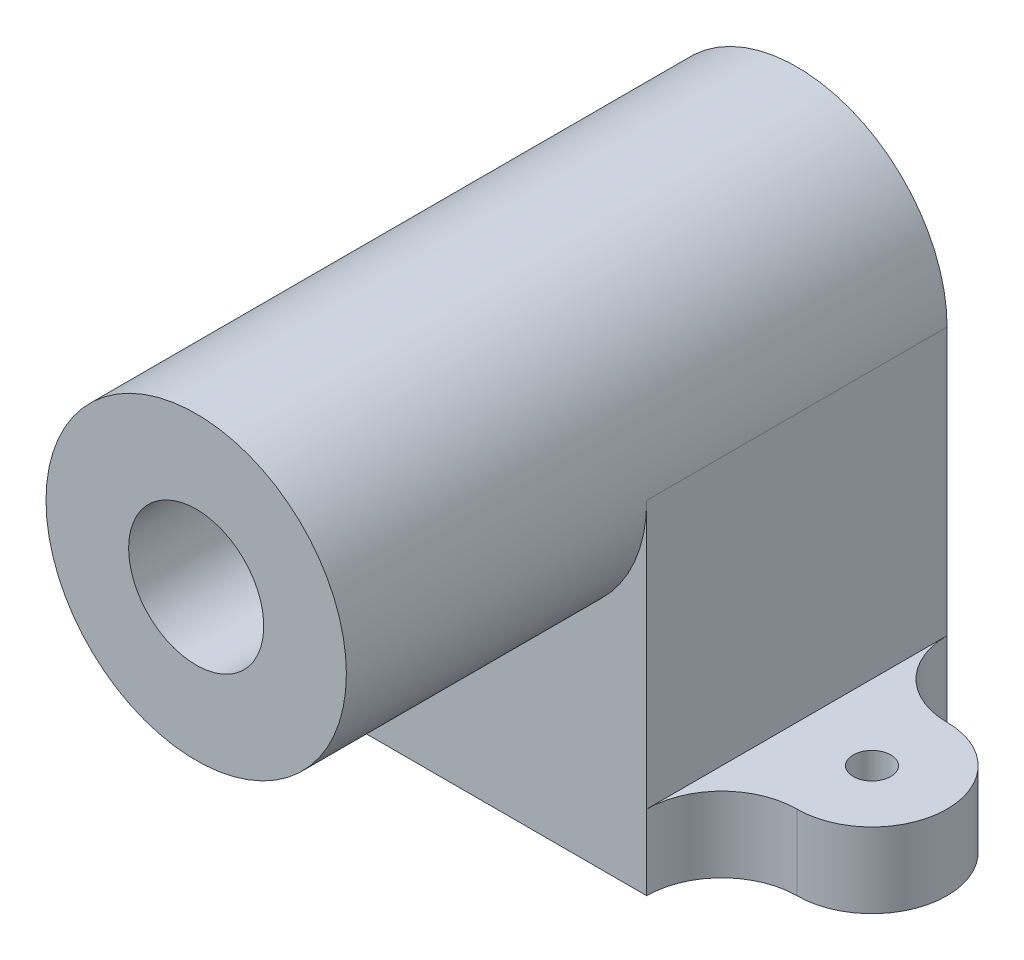
ISO-10303-21;
HEADER;
FILE_DESCRIPTION(('STEP AP214'),'2;1');
FILE_NAME('part.step','',(''),(''),'','','');
FILE_SCHEMA(('AUTOMOTIVE_DESIGN { 1 0 10303 214 1 1 1 1 }'));
ENDSEC;
DATA;
#1=APPLICATION_CONTEXT('core data for automotive mechanical design processes');
#2=APPLICATION_PROTOCOL_DEFINITION('international standard','automotive_design',2000,#1);
#3=PRODUCT_CONTEXT('',#1,'mechanical');
#4=PRODUCT('Part','Part','',(#3));
#5=PRODUCT_RELATED_PRODUCT_CATEGORY('part','',(#4));
#6=PRODUCT_DEFINITION_FORMATION('','',#4);
#7=PRODUCT_DEFINITION_CONTEXT('part definition',#1,'design');
#8=PRODUCT_DEFINITION('design','',#6,#7);
#9=PRODUCT_DEFINITION_SHAPE('','',#8);
#10=(LENGTH_UNIT() NAMED_UNIT(*) SI_UNIT(.MILLI.,.METRE.));
#11=(NAMED_UNIT(*) PLANE_ANGLE_UNIT() SI_UNIT($,.RADIAN.));
#12=(NAMED_UNIT(*) SI_UNIT($,.STERADIAN.) SOLID_ANGLE_UNIT());
#13=UNCERTAINTY_MEASURE_WITH_UNIT(LENGTH_MEASURE(1.E-05),#10,'distance_accuracy_value','');
#14=(GEOMETRIC_REPRESENTATION_CONTEXT(3) GLOBAL_UNCERTAINTY_ASSIGNED_CONTEXT((#13)) GLOBAL_UNIT_ASSIGNED_CONTEXT((#10,
#11,#12)) REPRESENTATION_CONTEXT('',''));
#15=CARTESIAN_POINT('',(0.,0.,0.));
#16=DIRECTION('',(0.,0.,1.));
#17=DIRECTION('',(1.,0.,0.));
#18=AXIS2_PLACEMENT_3D('',#15,#16,#17);
#19=CARTESIAN_POINT('',(-15.,5.,0.));
#20=DIRECTION('',(0.,1.,0.));
#21=DIRECTION('',(0.,0.,1.));
#22=AXIS2_PLACEMENT_3D('',#19,#20,#21);
#23=PLANE('',#22);
#24=DIRECTION('',(0.,0.,-1.));
#25=VECTOR('',#24,1.);
#26=CARTESIAN_POINT('',(9.99999999999999,5.,10.));
#27=LINE('',#26,#25);
#28=CARTESIAN_POINT('',(9.99999999999999,5.,9.99999999999999));
#29=VERTEX_POINT('',#28);
#30=CARTESIAN_POINT('',(9.99999999999999,5.,-10.));
#31=VERTEX_POINT('',#30);
#32=EDGE_CURVE('E145',#29,#31,#27,.T.);
#33=ORIENTED_EDGE('',*,*,#32,.F.);
#34=CARTESIAN_POINT('',(15.,5.,10.));
#35=DIRECTION('',(0.,1.,0.));
#36=DIRECTION('',(0.,0.,1.));
#37=AXIS2_PLACEMENT_3D('',#34,#35,#36);
#38=CIRCLE('',#37,5.);
#39=CARTESIAN_POINT('',(15.,5.,5.00000000000001));
#40=VERTEX_POINT('',#39);
#41=EDGE_CURVE('E201',#29,#40,#38,.F.);
#42=ORIENTED_EDGE('',*,*,#41,.T.);
#43=CARTESIAN_POINT('',(15.,5.,0.));
#44=DIRECTION('',(0.,1.,0.));
#45=DIRECTION('',(0.,0.,-1.));
#46=AXIS2_PLACEMENT_3D('',#43,#44,#45);
#47=CIRCLE('',#46,5.);
#48=CARTESIAN_POINT('',(15.,5.,-4.99999999999999));
#49=VERTEX_POINT('',#48);
#50=EDGE_CURVE('E164',#40,#49,#47,.T.);
#51=ORIENTED_EDGE('',*,*,#50,.T.);
#52=CARTESIAN_POINT('',(15.,5.,-9.99999999999999));
#53=DIRECTION('',(0.,1.,0.));
#54=DIRECTION('',(0.,0.,1.));
#55=AXIS2_PLACEMENT_3D('',#52,#53,#54);
#56=CIRCLE('',#55,5.);
#57=EDGE_CURVE('E196',#49,#31,#56,.F.);
#58=ORIENTED_EDGE('',*,*,#57,.T.);
#59=EDGE_LOOP('',(#33,#42,#51,#58));
#60=FACE_BOUND('',#59,.T.);
#61=CARTESIAN_POINT('',(15.,5.,0.));
#62=DIRECTION('',(0.,1.,0.));
#63=DIRECTION('',(0.,0.,-1.));
#64=AXIS2_PLACEMENT_3D('',#61,#62,#63);
#65=CIRCLE('',#64,1.24999999999999);
#66=CARTESIAN_POINT('',(15.,5.,-1.24999999999999));
#67=VERTEX_POINT('',#66);
#68=EDGE_CURVE('E150',#67,#67,#65,.T.);
#69=ORIENTED_EDGE('',*,*,#68,.F.);
#70=EDGE_LOOP('',(#69));
#71=FACE_BOUND('',#70,.T.);
#72=ADVANCED_FACE('F39',(#60,#71),#23,.T.);
#73=DIRECTION('',(0.,0.,1.));
#74=VECTOR('',#73,1.);
#75=CARTESIAN_POINT('',(-9.99999999999999,5.,10.));
#76=LINE('',#75,#74);
#77=CARTESIAN_POINT('',(-10.,5.,-10.));
#78=VERTEX_POINT('',#77);
#79=CARTESIAN_POINT('',(-10.,5.,9.99999999999999));
#80=VERTEX_POINT('',#79);
#81=EDGE_CURVE('E54',#78,#80,#76,.T.);
#82=ORIENTED_EDGE('',*,*,#81,.F.);
#83=CARTESIAN_POINT('',(-15.,5.,-9.99999999999999));
#84=DIRECTION('',(0.,1.,0.));
#85=DIRECTION('',(0.,0.,1.));
#86=AXIS2_PLACEMENT_3D('',#83,#84,#85);
#87=CIRCLE('',#86,5.);
#88=CARTESIAN_POINT('',(-15.,5.,-4.99999999999999));
#89=VERTEX_POINT('',#88);
#90=EDGE_CURVE('E209',#78,#89,#87,.F.);
#91=ORIENTED_EDGE('',*,*,#90,.T.);
#92=CARTESIAN_POINT('',(-15.,5.,0.));
#93=DIRECTION('',(0.,1.,0.));
#94=DIRECTION('',(0.,0.,1.));
#95=AXIS2_PLACEMENT_3D('',#92,#93,#94);
#96=CIRCLE('',#95,4.99999999999999);
#97=CARTESIAN_POINT('',(-15.,5.,5.));
#98=VERTEX_POINT('',#97);
#99=EDGE_CURVE('E162',#89,#98,#96,.T.);
#100=ORIENTED_EDGE('',*,*,#99,.T.);
#101=CARTESIAN_POINT('',(-15.,5.,9.99999999999999));
#102=DIRECTION('',(0.,1.,0.));
#103=DIRECTION('',(0.,0.,1.));
#104=AXIS2_PLACEMENT_3D('',#101,#102,#103);
#105=CIRCLE('',#104,5.);
#106=EDGE_CURVE('E205',#98,#80,#105,.F.);
#107=ORIENTED_EDGE('',*,*,#106,.T.);
#108=EDGE_LOOP('',(#82,#91,#100,#107));
#109=FACE_BOUND('',#108,.T.);
#110=CARTESIAN_POINT('',(-15.,5.,0.));
#111=DIRECTION('',(0.,1.,0.));
#112=DIRECTION('',(0.,0.,1.));
#113=AXIS2_PLACEMENT_3D('',#110,#111,#112);
#114=CIRCLE('',#113,1.25);
#115=CARTESIAN_POINT('',(-15.,5.,1.25000000000001));
#116=VERTEX_POINT('',#115);
#117=EDGE_CURVE('E156',#116,#116,#114,.T.);
#118=ORIENTED_EDGE('',*,*,#117,.F.);
#119=EDGE_LOOP('',(#118));
#120=FACE_BOUND('',#119,.T.);
#121=ADVANCED_FACE('F226',(#109,#120),#23,.T.);
#122=CARTESIAN_POINT('',(-15.,0.,0.));
#123=DIRECTION('',(0.,1.,0.));
#124=DIRECTION('',(0.,0.,1.));
#125=AXIS2_PLACEMENT_3D('',#122,#123,#124);
#126=PLANE('',#125);
#127=DIRECTION('',(-1.,0.,0.));
#128=VECTOR('',#127,1.);
#129=CARTESIAN_POINT('',(-10.,0.,-10.));
#130=LINE('',#129,#128);
#131=CARTESIAN_POINT('',(9.99999999999999,0.,-10.));
#132=VERTEX_POINT('',#131);
#133=CARTESIAN_POINT('',(-10.,0.,-10.));
#134=VERTEX_POINT('',#133);
#135=EDGE_CURVE('E159',#132,#134,#130,.T.);
#136=ORIENTED_EDGE('',*,*,#135,.F.);
#137=CARTESIAN_POINT('',(15.,0.,-9.99999999999999));
#138=DIRECTION('',(0.,1.,0.));
#139=DIRECTION('',(0.,0.,1.));
#140=AXIS2_PLACEMENT_3D('',#137,#138,#139);
#141=CIRCLE('',#140,5.);
#142=CARTESIAN_POINT('',(15.,0.,-4.99999999999999));
#143=VERTEX_POINT('',#142);
#144=EDGE_CURVE('E147',#132,#143,#141,.T.);
#145=ORIENTED_EDGE('',*,*,#144,.T.);
#146=CARTESIAN_POINT('',(15.,0.,0.));
#147=DIRECTION('',(0.,1.,0.));
#148=DIRECTION('',(0.,0.,-1.));
#149=AXIS2_PLACEMENT_3D('',#146,#147,#148);
#150=CIRCLE('',#149,5.);
#151=CARTESIAN_POINT('',(15.,0.,5.00000000000001));
#152=VERTEX_POINT('',#151);
#153=EDGE_CURVE('E165',#152,#143,#150,.T.);
#154=ORIENTED_EDGE('',*,*,#153,.F.);
#155=CARTESIAN_POINT('',(15.,0.,10.));
#156=DIRECTION('',(0.,1.,0.));
#157=DIRECTION('',(0.,0.,1.));
#158=AXIS2_PLACEMENT_3D('',#155,#156,#157);
#159=CIRCLE('',#158,5.);
#160=CARTESIAN_POINT('',(9.99999999999999,0.,9.99999999999999));
#161=VERTEX_POINT('',#160);
#162=EDGE_CURVE('E199',#152,#161,#159,.T.);
#163=ORIENTED_EDGE('',*,*,#162,.T.);
#164=DIRECTION('',(1.,0.,0.));
#165=VECTOR('',#164,1.);
#166=CARTESIAN_POINT('',(-10.,0.,9.99999999999999));
#167=LINE('',#166,#165);
#168=CARTESIAN_POINT('',(-10.,0.,9.99999999999999));
#169=VERTEX_POINT('',#168);
#170=EDGE_CURVE('E172',#169,#161,#167,.T.);
#171=ORIENTED_EDGE('',*,*,#170,.F.);
#172=CARTESIAN_POINT('',(-15.,0.,9.99999999999999));
#173=DIRECTION('',(0.,1.,0.));
#174=DIRECTION('',(0.,0.,1.));
#175=AXIS2_PLACEMENT_3D('',#172,#173,#174);
#176=CIRCLE('',#175,5.);
#177=CARTESIAN_POINT('',(-15.,0.,5.));
#178=VERTEX_POINT('',#177);
#179=EDGE_CURVE('E203',#169,#178,#176,.T.);
#180=ORIENTED_EDGE('',*,*,#179,.T.);
#181=CARTESIAN_POINT('',(-15.,0.,0.));
#182=DIRECTION('',(0.,1.,0.));
#183=DIRECTION('',(0.,0.,1.));
#184=AXIS2_PLACEMENT_3D('',#181,#182,#183);
#185=CIRCLE('',#184,4.99999999999999);
#186=CARTESIAN_POINT('',(-15.,0.,-4.99999999999999));
#187=VERTEX_POINT('',#186);
#188=EDGE_CURVE('E169',#187,#178,#185,.T.);
#189=ORIENTED_EDGE('',*,*,#188,.F.);
#190=CARTESIAN_POINT('',(-15.,0.,-9.99999999999999));
#191=DIRECTION('',(0.,1.,0.));
#192=DIRECTION('',(0.,0.,1.));
#193=AXIS2_PLACEMENT_3D('',#190,#191,#192);
#194=CIRCLE('',#193,5.);
#195=EDGE_CURVE('E207',#187,#134,#194,.T.);
#196=ORIENTED_EDGE('',*,*,#195,.T.);
#197=EDGE_LOOP('',(#136,#145,#154,#163,#171,#180,#189,#196));
#198=FACE_BOUND('',#197,.T.);
#199=CARTESIAN_POINT('',(-15.,0.,0.));
#200=DIRECTION('',(0.,1.,0.));
#201=DIRECTION('',(0.,0.,1.));
#202=AXIS2_PLACEMENT_3D('',#199,#200,#201);
#203=CIRCLE('',#202,1.25);
#204=CARTESIAN_POINT('',(-15.,0.,1.25000000000001));
#205=VERTEX_POINT('',#204);
#206=EDGE_CURVE('E153',#205,#205,#203,.T.);
#207=ORIENTED_EDGE('',*,*,#206,.T.);
#208=EDGE_LOOP('',(#207));
#209=FACE_BOUND('',#208,.T.);
#210=CARTESIAN_POINT('',(15.,0.,0.));
#211=DIRECTION('',(0.,1.,0.));
#212=DIRECTION('',(0.,0.,-1.));
#213=AXIS2_PLACEMENT_3D('',#210,#211,#212);
#214=CIRCLE('',#213,1.24999999999999);
#215=CARTESIAN_POINT('',(15.,0.,-1.24999999999999));
#216=VERTEX_POINT('',#215);
#217=EDGE_CURVE('E141',#216,#216,#214,.T.);
#218=ORIENTED_EDGE('',*,*,#217,.T.);
#219=EDGE_LOOP('',(#218));
#220=FACE_BOUND('',#219,.T.);
#221=ADVANCED_FACE('F232',(#198,#209,#220),#126,.F.);
#222=CARTESIAN_POINT('',(-10.,5.,-10.));
#223=DIRECTION('',(0.,0.,1.));
#224=DIRECTION('',(1.,0.,0.));
#225=AXIS2_PLACEMENT_3D('',#222,#223,#224);
#226=PLANE('',#225);
#227=CARTESIAN_POINT('',(0.,22.8,-10.));
#228=DIRECTION('',(0.,0.,1.));
#229=DIRECTION('',(1.,0.,0.));
#230=AXIS2_PLACEMENT_3D('',#227,#228,#229);
#231=CIRCLE('',#230,7.49999999999999);
#232=CARTESIAN_POINT('',(7.5,22.8,-10.));
#233=VERTEX_POINT('',#232);
#234=EDGE_CURVE('E11',#233,#233,#231,.T.);
#235=ORIENTED_EDGE('',*,*,#234,.T.);
#236=EDGE_LOOP('',(#235));
#237=FACE_BOUND('',#236,.T.);
#238=DIRECTION('',(0.,-1.,0.));
#239=VECTOR('',#238,1.);
#240=CARTESIAN_POINT('',(-10.,5.,-10.));
#241=LINE('',#240,#239);
#242=CARTESIAN_POINT('',(-9.99999999999999,22.8,-10.));
#243=VERTEX_POINT('',#242);
#244=EDGE_CURVE('E128',#243,#78,#241,.T.);
#245=ORIENTED_EDGE('',*,*,#244,.F.);
#246=CARTESIAN_POINT('',(0.,22.8,-10.));
#247=DIRECTION('',(0.,0.,-1.));
#248=DIRECTION('',(-1.,0.,0.));
#249=AXIS2_PLACEMENT_3D('',#246,#247,#248);
#250=CIRCLE('',#249,9.99999999999999);
#251=CARTESIAN_POINT('',(9.99999999999999,22.8,-10.));
#252=VERTEX_POINT('',#251);
#253=EDGE_CURVE('E114',#243,#252,#250,.T.);
#254=ORIENTED_EDGE('',*,*,#253,.T.);
#255=DIRECTION('',(0.,-1.,0.));
#256=VECTOR('',#255,1.);
#257=CARTESIAN_POINT('',(9.99999999999999,5.,-10.));
#258=LINE('',#257,#256);
#259=EDGE_CURVE('E149',#252,#31,#258,.T.);
#260=ORIENTED_EDGE('',*,*,#259,.T.);
#261=EDGE_CURVE('E134',#31,#132,#258,.T.);
#262=ORIENTED_EDGE('',*,*,#261,.T.);
#263=ORIENTED_EDGE('',*,*,#135,.T.);
#264=EDGE_CURVE('E132',#78,#134,#241,.T.);
#265=ORIENTED_EDGE('',*,*,#264,.F.);
#266=EDGE_LOOP('',(#245,#254,#260,#262,#263,#265));
#267=FACE_BOUND('',#266,.T.);
#268=ADVANCED_FACE('F129',(#237,#267),#226,.F.);
#269=CARTESIAN_POINT('',(-15.,5.,0.));
#270=DIRECTION('',(0.,-1.,0.));
#271=DIRECTION('',(0.,0.,-1.));
#272=AXIS2_PLACEMENT_3D('',#269,#270,#271);
#273=CYLINDRICAL_SURFACE('',#272,4.99999999999999);
#274=ORIENTED_EDGE('',*,*,#188,.T.);
#275=DIRECTION('',(0.,-1.,0.));
#276=VECTOR('',#275,1.);
#277=CARTESIAN_POINT('',(-15.,5.,5.));
#278=LINE('',#277,#276);
#279=EDGE_CURVE('E188',#98,#178,#278,.T.);
#280=ORIENTED_EDGE('',*,*,#279,.F.);
#281=ORIENTED_EDGE('',*,*,#99,.F.);
#282=DIRECTION('',(0.,-1.,0.));
#283=VECTOR('',#282,1.);
#284=CARTESIAN_POINT('',(-15.,5.,-4.99999999999999));
#285=LINE('',#284,#283);
#286=EDGE_CURVE('E191',#89,#187,#285,.T.);
#287=ORIENTED_EDGE('',*,*,#286,.T.);
#288=EDGE_LOOP('',(#274,#280,#281,#287));
#289=FACE_BOUND('',#288,.T.);
#290=ADVANCED_FACE('F255',(#289),#273,.T.);
#291=CARTESIAN_POINT('',(-10.,5.,9.99999999999999));
#292=DIRECTION('',(1.,0.,0.));
#293=DIRECTION('',(0.,0.,-1.));
#294=AXIS2_PLACEMENT_3D('',#291,#292,#293);
#295=PLANE('',#294);
#296=ORIENTED_EDGE('',*,*,#81,.T.);
#297=DIRECTION('',(0.,-1.,0.));
#298=VECTOR('',#297,1.);
#299=CARTESIAN_POINT('',(-10.,5.,9.99999999999999));
#300=LINE('',#299,#298);
#301=CARTESIAN_POINT('',(-10.,22.8,9.99999999999999));
#302=VERTEX_POINT('',#301);
#303=EDGE_CURVE('E138',#302,#80,#300,.T.);
#304=ORIENTED_EDGE('',*,*,#303,.F.);
#305=DIRECTION('',(0.,0.,-1.));
#306=VECTOR('',#305,1.);
#307=CARTESIAN_POINT('',(-9.99999999999999,22.8,10.));
#308=LINE('',#307,#306);
#309=EDGE_CURVE('E118',#302,#243,#308,.T.);
#310=ORIENTED_EDGE('',*,*,#309,.T.);
#311=ORIENTED_EDGE('',*,*,#244,.T.);
#312=EDGE_LOOP('',(#296,#304,#310,#311));
#313=FACE_BOUND('',#312,.T.);
#314=ADVANCED_FACE('F136',(#313),#295,.F.);
#315=CARTESIAN_POINT('',(-10.,5.,9.99999999999999));
#316=DIRECTION('',(0.,0.,-1.));
#317=DIRECTION('',(-1.,0.,0.));
#318=AXIS2_PLACEMENT_3D('',#315,#316,#317);
#319=PLANE('',#318);
#320=DIRECTION('',(0.,-1.,0.));
#321=VECTOR('',#320,1.);
#322=CARTESIAN_POINT('',(9.99999999999999,5.,9.99999999999999));
#323=LINE('',#322,#321);
#324=CARTESIAN_POINT('',(9.99999999999999,22.8,10.));
#325=VERTEX_POINT('',#324);
#326=EDGE_CURVE('E183',#325,#29,#323,.T.);
#327=ORIENTED_EDGE('',*,*,#326,.F.);
#328=CARTESIAN_POINT('',(0.,22.8,9.99999999999999));
#329=DIRECTION('',(0.,0.,-1.));
#330=DIRECTION('',(-1.,0.,0.));
#331=AXIS2_PLACEMENT_3D('',#328,#329,#330);
#332=CIRCLE('',#331,9.99999999999999);
#333=EDGE_CURVE('E139',#325,#302,#332,.T.);
#334=ORIENTED_EDGE('',*,*,#333,.T.);
#335=ORIENTED_EDGE('',*,*,#303,.T.);
#336=EDGE_CURVE('E186',#80,#169,#300,.T.);
#337=ORIENTED_EDGE('',*,*,#336,.T.);
#338=ORIENTED_EDGE('',*,*,#170,.T.);
#339=EDGE_CURVE('E182',#29,#161,#323,.T.);
#340=ORIENTED_EDGE('',*,*,#339,.F.);
#341=EDGE_LOOP('',(#327,#334,#335,#337,#338,#340));
#342=FACE_BOUND('',#341,.T.);
#343=ADVANCED_FACE('F248',(#342),#319,.F.);
#344=CARTESIAN_POINT('',(9.99999999999999,5.,9.99999999999999));
#345=DIRECTION('',(-1.,0.,0.));
#346=DIRECTION('',(0.,0.,1.));
#347=AXIS2_PLACEMENT_3D('',#344,#345,#346);
#348=PLANE('',#347);
#349=ORIENTED_EDGE('',*,*,#32,.T.);
#350=ORIENTED_EDGE('',*,*,#259,.F.);
#351=DIRECTION('',(0.,0.,1.));
#352=VECTOR('',#351,1.);
#353=CARTESIAN_POINT('',(9.99999999999999,22.8,10.));
#354=LINE('',#353,#352);
#355=EDGE_CURVE('E121',#252,#325,#354,.T.);
#356=ORIENTED_EDGE('',*,*,#355,.T.);
#357=ORIENTED_EDGE('',*,*,#326,.T.);
#358=EDGE_LOOP('',(#349,#350,#356,#357));
#359=FACE_BOUND('',#358,.T.);
#360=ADVANCED_FACE('F244',(#359),#348,.F.);
#361=CARTESIAN_POINT('',(15.,5.,0.));
#362=DIRECTION('',(0.,-1.,0.));
#363=DIRECTION('',(0.,0.,-1.));
#364=AXIS2_PLACEMENT_3D('',#361,#362,#363);
#365=CYLINDRICAL_SURFACE('',#364,5.);
#366=ORIENTED_EDGE('',*,*,#153,.T.);
#367=DIRECTION('',(0.,-1.,0.));
#368=VECTOR('',#367,1.);
#369=CARTESIAN_POINT('',(15.,5.,-4.99999999999999));
#370=LINE('',#369,#368);
#371=EDGE_CURVE('E167',#49,#143,#370,.T.);
#372=ORIENTED_EDGE('',*,*,#371,.F.);
#373=ORIENTED_EDGE('',*,*,#50,.F.);
#374=DIRECTION('',(0.,-1.,0.));
#375=VECTOR('',#374,1.);
#376=CARTESIAN_POINT('',(15.,5.,5.00000000000001));
#377=LINE('',#376,#375);
#378=EDGE_CURVE('E179',#40,#152,#377,.T.);
#379=ORIENTED_EDGE('',*,*,#378,.T.);
#380=EDGE_LOOP('',(#366,#372,#373,#379));
#381=FACE_BOUND('',#380,.T.);
#382=ADVANCED_FACE('F241',(#381),#365,.T.);
#383=CARTESIAN_POINT('',(-15.,5.,0.));
#384=DIRECTION('',(0.,-1.,0.));
#385=DIRECTION('',(0.,0.,-1.));
#386=AXIS2_PLACEMENT_3D('',#383,#384,#385);
#387=CYLINDRICAL_SURFACE('',#386,1.25);
#388=ORIENTED_EDGE('',*,*,#117,.T.);
#389=EDGE_LOOP('',(#388));
#390=FACE_BOUND('',#389,.T.);
#391=ORIENTED_EDGE('',*,*,#206,.F.);
#392=EDGE_LOOP('',(#391));
#393=FACE_BOUND('',#392,.T.);
#394=ADVANCED_FACE('F236',(#390,#393),#387,.F.);
#395=CARTESIAN_POINT('',(15.,5.,0.));
#396=DIRECTION('',(0.,-1.,0.));
#397=DIRECTION('',(0.,0.,-1.));
#398=AXIS2_PLACEMENT_3D('',#395,#396,#397);
#399=CYLINDRICAL_SURFACE('',#398,1.24999999999999);
#400=ORIENTED_EDGE('',*,*,#68,.T.);
#401=EDGE_LOOP('',(#400));
#402=FACE_BOUND('',#401,.T.);
#403=ORIENTED_EDGE('',*,*,#217,.F.);
#404=EDGE_LOOP('',(#403));
#405=FACE_BOUND('',#404,.T.);
#406=ADVANCED_FACE('F300',(#402,#405),#399,.F.);
#407=CARTESIAN_POINT('',(0.,22.8,30.));
#408=DIRECTION('',(0.,0.,-1.));
#409=DIRECTION('',(-1.,0.,0.));
#410=AXIS2_PLACEMENT_3D('',#407,#408,#409);
#411=CYLINDRICAL_SURFACE('',#410,9.99999999999999);
#412=CARTESIAN_POINT('',(0.,22.8,30.));
#413=DIRECTION('',(0.,0.,-1.));
#414=DIRECTION('',(-1.,0.,0.));
#415=AXIS2_PLACEMENT_3D('',#412,#413,#414);
#416=CIRCLE('',#415,9.99999999999999);
#417=CARTESIAN_POINT('',(-10.,22.8,30.));
#418=VERTEX_POINT('',#417);
#419=EDGE_CURVE('E125',#418,#418,#416,.T.);
#420=ORIENTED_EDGE('',*,*,#419,.T.);
#421=EDGE_LOOP('',(#420));
#422=FACE_BOUND('',#421,.T.);
#423=ORIENTED_EDGE('',*,*,#309,.F.);
#424=ORIENTED_EDGE('',*,*,#333,.F.);
#425=ORIENTED_EDGE('',*,*,#355,.F.);
#426=ORIENTED_EDGE('',*,*,#253,.F.);
#427=EDGE_LOOP('',(#423,#424,#425,#426));
#428=FACE_BOUND('',#427,.T.);
#429=ADVANCED_FACE('F116',(#422,#428),#411,.T.);
#430=CARTESIAN_POINT('',(0.,0.,30.));
#431=DIRECTION('',(0.,0.,-1.));
#432=DIRECTION('',(-1.,0.,0.));
#433=AXIS2_PLACEMENT_3D('',#430,#431,#432);
#434=PLANE('',#433);
#435=CARTESIAN_POINT('',(0.,22.8,30.));
#436=DIRECTION('',(0.,0.,-1.));
#437=DIRECTION('',(-1.,0.,0.));
#438=AXIS2_PLACEMENT_3D('',#435,#436,#437);
#439=CIRCLE('',#438,4.5);
#440=CARTESIAN_POINT('',(-4.5,22.8,30.));
#441=VERTEX_POINT('',#440);
#442=EDGE_CURVE('E126',#441,#441,#439,.T.);
#443=ORIENTED_EDGE('',*,*,#442,.T.);
#444=EDGE_LOOP('',(#443));
#445=FACE_BOUND('',#444,.T.);
#446=ORIENTED_EDGE('',*,*,#419,.F.);
#447=EDGE_LOOP('',(#446));
#448=FACE_BOUND('',#447,.T.);
#449=ADVANCED_FACE('F307',(#445,#448),#434,.F.);
#450=CARTESIAN_POINT('',(0.,22.8,30.));
#451=DIRECTION('',(0.,0.,-1.));
#452=DIRECTION('',(-1.,0.,0.));
#453=AXIS2_PLACEMENT_3D('',#450,#451,#452);
#454=CYLINDRICAL_SURFACE('',#453,4.5);
#455=CARTESIAN_POINT('',(0.,22.8,-7.00000000000002));
#456=DIRECTION('',(0.,0.,1.));
#457=DIRECTION('',(1.,0.,0.));
#458=AXIS2_PLACEMENT_3D('',#455,#456,#457);
#459=CIRCLE('',#458,4.5);
#460=CARTESIAN_POINT('',(4.5,22.8,-7.00000000000002));
#461=VERTEX_POINT('',#460);
#462=EDGE_CURVE('E47',#461,#461,#459,.F.);
#463=ORIENTED_EDGE('',*,*,#462,.T.);
#464=EDGE_LOOP('',(#463));
#465=FACE_BOUND('',#464,.T.);
#466=ORIENTED_EDGE('',*,*,#442,.F.);
#467=EDGE_LOOP('',(#466));
#468=FACE_BOUND('',#467,.T.);
#469=ADVANCED_FACE('F213',(#465,#468),#454,.F.);
#470=CARTESIAN_POINT('',(15.,5.,-9.99999999999999));
#471=DIRECTION('',(0.,1.,0.));
#472=DIRECTION('',(0.,0.,1.));
#473=AXIS2_PLACEMENT_3D('',#470,#471,#472);
#474=CYLINDRICAL_SURFACE('',#473,5.);
#475=ORIENTED_EDGE('',*,*,#57,.F.);
#476=ORIENTED_EDGE('',*,*,#371,.T.);
#477=ORIENTED_EDGE('',*,*,#144,.F.);
#478=ORIENTED_EDGE('',*,*,#261,.F.);
#479=EDGE_LOOP('',(#475,#476,#477,#478));
#480=FACE_BOUND('',#479,.T.);
#481=ADVANCED_FACE('F262',(#480),#474,.F.);
#482=CARTESIAN_POINT('',(15.,5.,10.));
#483=DIRECTION('',(0.,1.,0.));
#484=DIRECTION('',(0.,0.,1.));
#485=AXIS2_PLACEMENT_3D('',#482,#483,#484);
#486=CYLINDRICAL_SURFACE('',#485,5.);
#487=ORIENTED_EDGE('',*,*,#41,.F.);
#488=ORIENTED_EDGE('',*,*,#339,.T.);
#489=ORIENTED_EDGE('',*,*,#162,.F.);
#490=ORIENTED_EDGE('',*,*,#378,.F.);
#491=EDGE_LOOP('',(#487,#488,#489,#490));
#492=FACE_BOUND('',#491,.T.);
#493=ADVANCED_FACE('F265',(#492),#486,.F.);
#494=CARTESIAN_POINT('',(-15.,5.,9.99999999999999));
#495=DIRECTION('',(0.,1.,0.));
#496=DIRECTION('',(0.,0.,1.));
#497=AXIS2_PLACEMENT_3D('',#494,#495,#496);
#498=CYLINDRICAL_SURFACE('',#497,5.);
#499=ORIENTED_EDGE('',*,*,#106,.F.);
#500=ORIENTED_EDGE('',*,*,#279,.T.);
#501=ORIENTED_EDGE('',*,*,#179,.F.);
#502=ORIENTED_EDGE('',*,*,#336,.F.);
#503=EDGE_LOOP('',(#499,#500,#501,#502));
#504=FACE_BOUND('',#503,.T.);
#505=ADVANCED_FACE('F222',(#504),#498,.F.);
#506=CARTESIAN_POINT('',(-15.,5.,-9.99999999999999));
#507=DIRECTION('',(0.,1.,0.));
#508=DIRECTION('',(0.,0.,1.));
#509=AXIS2_PLACEMENT_3D('',#506,#507,#508);
#510=CYLINDRICAL_SURFACE('',#509,5.);
#511=ORIENTED_EDGE('',*,*,#90,.F.);
#512=ORIENTED_EDGE('',*,*,#264,.T.);
#513=ORIENTED_EDGE('',*,*,#195,.F.);
#514=ORIENTED_EDGE('',*,*,#286,.F.);
#515=EDGE_LOOP('',(#511,#512,#513,#514));
#516=FACE_BOUND('',#515,.T.);
#517=ADVANCED_FACE('F217',(#516),#510,.F.);
#518=CARTESIAN_POINT('',(0.,22.8,-7.00000000000002));
#519=DIRECTION('',(0.,0.,-1.));
#520=DIRECTION('',(-1.,0.,0.));
#521=AXIS2_PLACEMENT_3D('',#518,#519,#520);
#522=CONICAL_SURFACE('',#521,4.5,0.78539816339745);
#523=ORIENTED_EDGE('',*,*,#234,.F.);
#524=EDGE_LOOP('',(#523));
#525=FACE_BOUND('',#524,.T.);
#526=ORIENTED_EDGE('',*,*,#462,.F.);
#527=EDGE_LOOP('',(#526));
#528=FACE_BOUND('',#527,.T.);
#529=ADVANCED_FACE('F41',(#525,#528),#522,.F.);
#530=CLOSED_SHELL('',(#72,#121,#221,#268,#290,#314,#343,#360,#382,#394,#406,#429,#449,#469,#481,
#493,#505,#517,#529));
#531=MANIFOLD_SOLID_BREP('B2',#530);
#532=ADVANCED_BREP_SHAPE_REPRESENTATION('',(#18,#531),#14);
#533=SHAPE_DEFINITION_REPRESENTATION(#9,#532);
ENDSEC;
END-ISO-10303-21;
